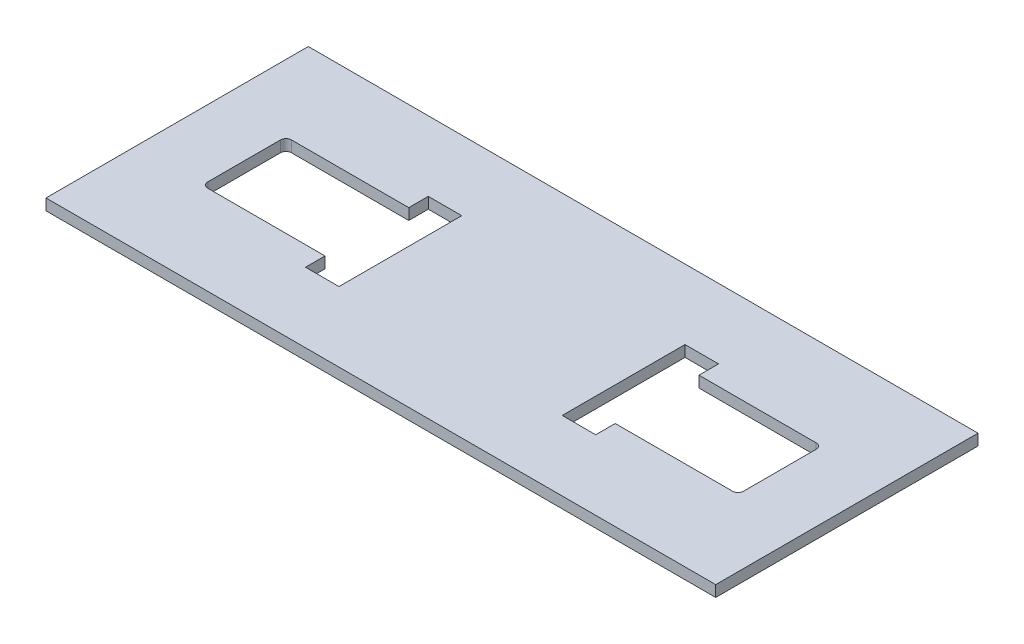
ISO-10303-21;
HEADER;
FILE_DESCRIPTION(('STEP AP214'),'2;1');
FILE_NAME('part.step','',(''),(''),'','','');
FILE_SCHEMA(('AUTOMOTIVE_DESIGN { 1 0 10303 214 1 1 1 1 }'));
ENDSEC;
DATA;
#1=APPLICATION_CONTEXT('core data for automotive mechanical design processes');
#2=APPLICATION_PROTOCOL_DEFINITION('international standard','automotive_design',2000,#1);
#3=PRODUCT_CONTEXT('',#1,'mechanical');
#4=PRODUCT('Part','Part','',(#3));
#5=PRODUCT_RELATED_PRODUCT_CATEGORY('part','',(#4));
#6=PRODUCT_DEFINITION_FORMATION('','',#4);
#7=PRODUCT_DEFINITION_CONTEXT('part definition',#1,'design');
#8=PRODUCT_DEFINITION('design','',#6,#7);
#9=PRODUCT_DEFINITION_SHAPE('','',#8);
#10=(LENGTH_UNIT() NAMED_UNIT(*) SI_UNIT(.MILLI.,.METRE.));
#11=(NAMED_UNIT(*) PLANE_ANGLE_UNIT() SI_UNIT($,.RADIAN.));
#12=(NAMED_UNIT(*) SI_UNIT($,.STERADIAN.) SOLID_ANGLE_UNIT());
#13=UNCERTAINTY_MEASURE_WITH_UNIT(LENGTH_MEASURE(1.E-05),#10,'distance_accuracy_value','');
#14=(GEOMETRIC_REPRESENTATION_CONTEXT(3) GLOBAL_UNCERTAINTY_ASSIGNED_CONTEXT((#13)) GLOBAL_UNIT_ASSIGNED_CONTEXT((#10,
#11,#12)) REPRESENTATION_CONTEXT('',''));
#15=CARTESIAN_POINT('',(0.,0.,0.));
#16=DIRECTION('',(0.,0.,1.));
#17=DIRECTION('',(1.,0.,0.));
#18=AXIS2_PLACEMENT_3D('',#15,#16,#17);
#19=CARTESIAN_POINT('',(0.,6.35,0.));
#20=DIRECTION('',(0.,-1.,0.));
#21=DIRECTION('',(0.,0.,-1.));
#22=AXIS2_PLACEMENT_3D('',#19,#20,#21);
#23=PLANE('',#22);
#24=DIRECTION('',(1.,0.,0.));
#25=VECTOR('',#24,1.);
#26=CARTESIAN_POINT('',(107.95,6.35,-39.6875));
#27=LINE('',#26,#25);
#28=CARTESIAN_POINT('',(107.95,6.35,-39.6875));
#29=VERTEX_POINT('',#28);
#30=CARTESIAN_POINT('',(127.,6.35,-39.6875));
#31=VERTEX_POINT('',#30);
#32=EDGE_CURVE('E198',#29,#31,#27,.T.);
#33=ORIENTED_EDGE('',*,*,#32,.F.);
#34=DIRECTION('',(0.,0.,1.));
#35=VECTOR('',#34,1.);
#36=CARTESIAN_POINT('',(107.95,6.35000000000001,-53.975));
#37=LINE('',#36,#35);
#38=CARTESIAN_POINT('',(107.95,6.35000000000001,-50.8));
#39=VERTEX_POINT('',#38);
#40=EDGE_CURVE('E206',#39,#29,#37,.T.);
#41=ORIENTED_EDGE('',*,*,#40,.F.);
#42=DIRECTION('',(1.,0.,0.));
#43=VECTOR('',#42,1.);
#44=CARTESIAN_POINT('',(123.825,6.35,-50.8));
#45=LINE('',#44,#43);
#46=CARTESIAN_POINT('',(41.275,6.35,-50.8));
#47=VERTEX_POINT('',#46);
#48=EDGE_CURVE('E302',#47,#39,#45,.T.);
#49=ORIENTED_EDGE('',*,*,#48,.F.);
#50=CARTESIAN_POINT('',(41.275,6.35,-53.975));
#51=DIRECTION('',(0.,1.,0.));
#52=DIRECTION('',(0.,0.,1.));
#53=AXIS2_PLACEMENT_3D('',#50,#51,#52);
#54=CIRCLE('',#53,3.17499999999999);
#55=CARTESIAN_POINT('',(38.1,6.35,-53.975));
#56=VERTEX_POINT('',#55);
#57=EDGE_CURVE('E300',#56,#47,#54,.T.);
#58=ORIENTED_EDGE('',*,*,#57,.F.);
#59=DIRECTION('',(0.,0.,1.));
#60=VECTOR('',#59,1.);
#61=CARTESIAN_POINT('',(38.1,6.35,-95.25));
#62=LINE('',#61,#60);
#63=CARTESIAN_POINT('',(38.1,6.35,-95.25));
#64=VERTEX_POINT('',#63);
#65=EDGE_CURVE('E311',#64,#56,#62,.T.);
#66=ORIENTED_EDGE('',*,*,#65,.F.);
#67=CARTESIAN_POINT('',(41.275,6.35,-95.25));
#68=DIRECTION('',(0.,1.,0.));
#69=DIRECTION('',(0.,0.,-1.));
#70=AXIS2_PLACEMENT_3D('',#67,#68,#69);
#71=CIRCLE('',#70,3.175);
#72=CARTESIAN_POINT('',(41.275,6.35,-98.425));
#73=VERTEX_POINT('',#72);
#74=EDGE_CURVE('E308',#73,#64,#71,.T.);
#75=ORIENTED_EDGE('',*,*,#74,.F.);
#76=DIRECTION('',(-1.,0.,0.));
#77=VECTOR('',#76,1.);
#78=CARTESIAN_POINT('',(41.275,6.35,-98.425));
#79=LINE('',#78,#77);
#80=CARTESIAN_POINT('',(107.95,6.35,-98.425));
#81=VERTEX_POINT('',#80);
#82=EDGE_CURVE('E306',#81,#73,#79,.T.);
#83=ORIENTED_EDGE('',*,*,#82,.F.);
#84=DIRECTION('',(0.,0.,1.));
#85=VECTOR('',#84,1.);
#86=CARTESIAN_POINT('',(107.95,6.35000000000001,-95.25));
#87=LINE('',#86,#85);
#88=CARTESIAN_POINT('',(107.95,6.35000000000001,-109.5375));
#89=VERTEX_POINT('',#88);
#90=EDGE_CURVE('E48',#89,#81,#87,.T.);
#91=ORIENTED_EDGE('',*,*,#90,.F.);
#92=DIRECTION('',(-1.,0.,0.));
#93=VECTOR('',#92,1.);
#94=CARTESIAN_POINT('',(107.95,6.35000000000001,-109.5375));
#95=LINE('',#94,#93);
#96=CARTESIAN_POINT('',(127.,6.35000000000001,-109.5375));
#97=VERTEX_POINT('',#96);
#98=EDGE_CURVE('E242',#97,#89,#95,.T.);
#99=ORIENTED_EDGE('',*,*,#98,.F.);
#100=DIRECTION('',(0.,0.,-1.));
#101=VECTOR('',#100,1.);
#102=CARTESIAN_POINT('',(127.,6.35,-95.25));
#103=LINE('',#102,#101);
#104=EDGE_CURVE('E217',#31,#97,#103,.T.);
#105=ORIENTED_EDGE('',*,*,#104,.F.);
#106=EDGE_LOOP('',(#33,#41,#49,#58,#66,#75,#83,#91,#99,#105));
#107=FACE_BOUND('',#106,.T.);
#108=DIRECTION('',(0.,0.,1.));
#109=VECTOR('',#108,1.);
#110=CARTESIAN_POINT('',(0.,6.35,0.));
#111=LINE('',#110,#109);
#112=CARTESIAN_POINT('',(0.,6.35,-149.225));
#113=VERTEX_POINT('',#112);
#114=CARTESIAN_POINT('',(0.,6.35,0.));
#115=VERTEX_POINT('',#114);
#116=EDGE_CURVE('E339',#113,#115,#111,.T.);
#117=ORIENTED_EDGE('',*,*,#116,.T.);
#118=DIRECTION('',(1.,0.,0.));
#119=VECTOR('',#118,1.);
#120=CARTESIAN_POINT('',(0.,6.35,0.));
#121=LINE('',#120,#119);
#122=CARTESIAN_POINT('',(381.,6.35,0.));
#123=VERTEX_POINT('',#122);
#124=EDGE_CURVE('E342',#115,#123,#121,.T.);
#125=ORIENTED_EDGE('',*,*,#124,.T.);
#126=DIRECTION('',(0.,0.,-1.));
#127=VECTOR('',#126,1.);
#128=CARTESIAN_POINT('',(381.,6.35,0.));
#129=LINE('',#128,#127);
#130=CARTESIAN_POINT('',(381.,6.35,-149.225));
#131=VERTEX_POINT('',#130);
#132=EDGE_CURVE('E345',#123,#131,#129,.T.);
#133=ORIENTED_EDGE('',*,*,#132,.T.);
#134=DIRECTION('',(-1.,0.,0.));
#135=VECTOR('',#134,1.);
#136=CARTESIAN_POINT('',(0.,6.35,-149.225));
#137=LINE('',#136,#135);
#138=EDGE_CURVE('E347',#131,#113,#137,.T.);
#139=ORIENTED_EDGE('',*,*,#138,.T.);
#140=EDGE_LOOP('',(#117,#125,#133,#139));
#141=FACE_BOUND('',#140,.T.);
#142=DIRECTION('',(-1.,0.,0.));
#143=VECTOR('',#142,1.);
#144=CARTESIAN_POINT('',(273.05,6.35000000000001,-109.5375));
#145=LINE('',#144,#143);
#146=CARTESIAN_POINT('',(273.05,6.35000000000001,-109.5375));
#147=VERTEX_POINT('',#146);
#148=CARTESIAN_POINT('',(254.,6.35000000000001,-109.5375));
#149=VERTEX_POINT('',#148);
#150=EDGE_CURVE('E234',#147,#149,#145,.T.);
#151=ORIENTED_EDGE('',*,*,#150,.F.);
#152=DIRECTION('',(0.,0.,-1.));
#153=VECTOR('',#152,1.);
#154=CARTESIAN_POINT('',(273.05,6.35000000000001,-95.25));
#155=LINE('',#154,#153);
#156=CARTESIAN_POINT('',(273.05,6.35000000000001,-98.425));
#157=VERTEX_POINT('',#156);
#158=EDGE_CURVE('E231',#157,#147,#155,.T.);
#159=ORIENTED_EDGE('',*,*,#158,.F.);
#160=DIRECTION('',(-1.,0.,0.));
#161=VECTOR('',#160,1.);
#162=CARTESIAN_POINT('',(339.725,6.35,-98.425));
#163=LINE('',#162,#161);
#164=CARTESIAN_POINT('',(339.725,6.35,-98.425));
#165=VERTEX_POINT('',#164);
#166=EDGE_CURVE('E261',#165,#157,#163,.T.);
#167=ORIENTED_EDGE('',*,*,#166,.F.);
#168=CARTESIAN_POINT('',(339.725,6.35,-95.25));
#169=DIRECTION('',(0.,1.,0.));
#170=DIRECTION('',(0.,0.,1.));
#171=AXIS2_PLACEMENT_3D('',#168,#169,#170);
#172=CIRCLE('',#171,3.17500000000002);
#173=CARTESIAN_POINT('',(342.9,6.35,-95.25));
#174=VERTEX_POINT('',#173);
#175=EDGE_CURVE('E259',#174,#165,#172,.T.);
#176=ORIENTED_EDGE('',*,*,#175,.F.);
#177=DIRECTION('',(0.,0.,-1.));
#178=VECTOR('',#177,1.);
#179=CARTESIAN_POINT('',(342.9,6.35,-95.25));
#180=LINE('',#179,#178);
#181=CARTESIAN_POINT('',(342.9,6.35,-53.975));
#182=VERTEX_POINT('',#181);
#183=EDGE_CURVE('E272',#182,#174,#180,.T.);
#184=ORIENTED_EDGE('',*,*,#183,.F.);
#185=CARTESIAN_POINT('',(339.725,6.35,-53.975));
#186=DIRECTION('',(0.,1.,0.));
#187=DIRECTION('',(0.,0.,-1.));
#188=AXIS2_PLACEMENT_3D('',#185,#186,#187);
#189=CIRCLE('',#188,3.17500000000002);
#190=CARTESIAN_POINT('',(339.725,6.35,-50.8));
#191=VERTEX_POINT('',#190);
#192=EDGE_CURVE('E269',#191,#182,#189,.T.);
#193=ORIENTED_EDGE('',*,*,#192,.F.);
#194=DIRECTION('',(1.,0.,0.));
#195=VECTOR('',#194,1.);
#196=CARTESIAN_POINT('',(257.175,6.35,-50.8));
#197=LINE('',#196,#195);
#198=CARTESIAN_POINT('',(273.05,6.35,-50.8));
#199=VERTEX_POINT('',#198);
#200=EDGE_CURVE('E267',#199,#191,#197,.T.);
#201=ORIENTED_EDGE('',*,*,#200,.F.);
#202=DIRECTION('',(0.,0.,-1.));
#203=VECTOR('',#202,1.);
#204=CARTESIAN_POINT('',(273.05,6.35000000000001,-53.975));
#205=LINE('',#204,#203);
#206=CARTESIAN_POINT('',(273.05,6.35,-39.6875));
#207=VERTEX_POINT('',#206);
#208=EDGE_CURVE('E56',#207,#199,#205,.T.);
#209=ORIENTED_EDGE('',*,*,#208,.F.);
#210=DIRECTION('',(1.,0.,0.));
#211=VECTOR('',#210,1.);
#212=CARTESIAN_POINT('',(273.05,6.35,-39.6875));
#213=LINE('',#212,#211);
#214=CARTESIAN_POINT('',(254.,6.35,-39.6875));
#215=VERTEX_POINT('',#214);
#216=EDGE_CURVE('E222',#215,#207,#213,.T.);
#217=ORIENTED_EDGE('',*,*,#216,.F.);
#218=DIRECTION('',(0.,0.,1.));
#219=VECTOR('',#218,1.);
#220=CARTESIAN_POINT('',(254.,6.35,-95.25));
#221=LINE('',#220,#219);
#222=EDGE_CURVE('E265',#149,#215,#221,.T.);
#223=ORIENTED_EDGE('',*,*,#222,.F.);
#224=EDGE_LOOP('',(#151,#159,#167,#176,#184,#193,#201,#209,#217,#223));
#225=FACE_BOUND('',#224,.T.);
#226=ADVANCED_FACE('F33',(#107,#141,#225),#23,.F.);
#227=CARTESIAN_POINT('',(0.,0.,0.));
#228=DIRECTION('',(0.,-1.,0.));
#229=DIRECTION('',(0.,0.,-1.));
#230=AXIS2_PLACEMENT_3D('',#227,#228,#229);
#231=PLANE('',#230);
#232=DIRECTION('',(0.,0.,1.));
#233=VECTOR('',#232,1.);
#234=CARTESIAN_POINT('',(273.05,0.,0.));
#235=LINE('',#234,#233);
#236=CARTESIAN_POINT('',(273.05,0.,-109.5375));
#237=VERTEX_POINT('',#236);
#238=CARTESIAN_POINT('',(273.05,0.,-98.425));
#239=VERTEX_POINT('',#238);
#240=EDGE_CURVE('E252',#237,#239,#235,.T.);
#241=ORIENTED_EDGE('',*,*,#240,.F.);
#242=DIRECTION('',(1.,0.,0.));
#243=VECTOR('',#242,1.);
#244=CARTESIAN_POINT('',(0.,0.,-109.5375));
#245=LINE('',#244,#243);
#246=CARTESIAN_POINT('',(254.,0.,-109.5375));
#247=VERTEX_POINT('',#246);
#248=EDGE_CURVE('E11',#247,#237,#245,.T.);
#249=ORIENTED_EDGE('',*,*,#248,.F.);
#250=DIRECTION('',(0.,0.,1.));
#251=VECTOR('',#250,1.);
#252=CARTESIAN_POINT('',(254.,0.,-95.25));
#253=LINE('',#252,#251);
#254=CARTESIAN_POINT('',(254.,0.,-39.6875));
#255=VERTEX_POINT('',#254);
#256=EDGE_CURVE('E280',#247,#255,#253,.T.);
#257=ORIENTED_EDGE('',*,*,#256,.T.);
#258=DIRECTION('',(-1.,0.,0.));
#259=VECTOR('',#258,1.);
#260=CARTESIAN_POINT('',(0.,0.,-39.6875));
#261=LINE('',#260,#259);
#262=CARTESIAN_POINT('',(273.05,0.,-39.6875));
#263=VERTEX_POINT('',#262);
#264=EDGE_CURVE('E41',#263,#255,#261,.T.);
#265=ORIENTED_EDGE('',*,*,#264,.F.);
#266=DIRECTION('',(0.,0.,1.));
#267=VECTOR('',#266,1.);
#268=CARTESIAN_POINT('',(273.05,0.,0.));
#269=LINE('',#268,#267);
#270=CARTESIAN_POINT('',(273.05,0.,-50.8));
#271=VERTEX_POINT('',#270);
#272=EDGE_CURVE('E248',#271,#263,#269,.T.);
#273=ORIENTED_EDGE('',*,*,#272,.F.);
#274=DIRECTION('',(1.,0.,0.));
#275=VECTOR('',#274,1.);
#276=CARTESIAN_POINT('',(257.175,0.,-50.8));
#277=LINE('',#276,#275);
#278=CARTESIAN_POINT('',(339.725,0.,-50.8));
#279=VERTEX_POINT('',#278);
#280=EDGE_CURVE('E282',#271,#279,#277,.T.);
#281=ORIENTED_EDGE('',*,*,#280,.T.);
#282=CARTESIAN_POINT('',(339.725,0.,-53.975));
#283=DIRECTION('',(0.,1.,0.));
#284=DIRECTION('',(0.,0.,-1.));
#285=AXIS2_PLACEMENT_3D('',#282,#283,#284);
#286=CIRCLE('',#285,3.17500000000002);
#287=CARTESIAN_POINT('',(342.9,0.,-53.975));
#288=VERTEX_POINT('',#287);
#289=EDGE_CURVE('E284',#279,#288,#286,.T.);
#290=ORIENTED_EDGE('',*,*,#289,.T.);
#291=DIRECTION('',(0.,0.,-1.));
#292=VECTOR('',#291,1.);
#293=CARTESIAN_POINT('',(342.9,0.,-95.25));
#294=LINE('',#293,#292);
#295=CARTESIAN_POINT('',(342.9,0.,-95.25));
#296=VERTEX_POINT('',#295);
#297=EDGE_CURVE('E262',#288,#296,#294,.T.);
#298=ORIENTED_EDGE('',*,*,#297,.T.);
#299=CARTESIAN_POINT('',(339.725,0.,-95.25));
#300=DIRECTION('',(0.,1.,0.));
#301=DIRECTION('',(0.,0.,1.));
#302=AXIS2_PLACEMENT_3D('',#299,#300,#301);
#303=CIRCLE('',#302,3.17500000000002);
#304=CARTESIAN_POINT('',(339.725,0.,-98.425));
#305=VERTEX_POINT('',#304);
#306=EDGE_CURVE('E258',#296,#305,#303,.T.);
#307=ORIENTED_EDGE('',*,*,#306,.T.);
#308=DIRECTION('',(-1.,0.,0.));
#309=VECTOR('',#308,1.);
#310=CARTESIAN_POINT('',(339.725,0.,-98.425));
#311=LINE('',#310,#309);
#312=EDGE_CURVE('E277',#305,#239,#311,.T.);
#313=ORIENTED_EDGE('',*,*,#312,.T.);
#314=EDGE_LOOP('',(#241,#249,#257,#265,#273,#281,#290,#298,#307,#313));
#315=FACE_BOUND('',#314,.T.);
#316=DIRECTION('',(0.,0.,-1.));
#317=VECTOR('',#316,1.);
#318=CARTESIAN_POINT('',(107.95,0.,0.));
#319=LINE('',#318,#317);
#320=CARTESIAN_POINT('',(107.95,0.,-39.6875));
#321=VERTEX_POINT('',#320);
#322=CARTESIAN_POINT('',(107.95,0.,-50.8));
#323=VERTEX_POINT('',#322);
#324=EDGE_CURVE('E256',#321,#323,#319,.T.);
#325=ORIENTED_EDGE('',*,*,#324,.F.);
#326=DIRECTION('',(-1.,0.,0.));
#327=VECTOR('',#326,1.);
#328=CARTESIAN_POINT('',(0.,0.,-39.6875));
#329=LINE('',#328,#327);
#330=CARTESIAN_POINT('',(127.,0.,-39.6875));
#331=VERTEX_POINT('',#330);
#332=EDGE_CURVE('E200',#331,#321,#329,.T.);
#333=ORIENTED_EDGE('',*,*,#332,.F.);
#334=DIRECTION('',(0.,0.,-1.));
#335=VECTOR('',#334,1.);
#336=CARTESIAN_POINT('',(127.,0.,-95.25));
#337=LINE('',#336,#335);
#338=CARTESIAN_POINT('',(127.,0.,-109.5375));
#339=VERTEX_POINT('',#338);
#340=EDGE_CURVE('E319',#331,#339,#337,.T.);
#341=ORIENTED_EDGE('',*,*,#340,.T.);
#342=DIRECTION('',(1.,0.,0.));
#343=VECTOR('',#342,1.);
#344=CARTESIAN_POINT('',(0.,0.,-109.5375));
#345=LINE('',#344,#343);
#346=CARTESIAN_POINT('',(107.95,0.,-109.5375));
#347=VERTEX_POINT('',#346);
#348=EDGE_CURVE('E375',#347,#339,#345,.T.);
#349=ORIENTED_EDGE('',*,*,#348,.F.);
#350=DIRECTION('',(0.,0.,-1.));
#351=VECTOR('',#350,1.);
#352=CARTESIAN_POINT('',(107.95,0.,0.));
#353=LINE('',#352,#351);
#354=CARTESIAN_POINT('',(107.95,0.,-98.425));
#355=VERTEX_POINT('',#354);
#356=EDGE_CURVE('E254',#355,#347,#353,.T.);
#357=ORIENTED_EDGE('',*,*,#356,.F.);
#358=DIRECTION('',(-1.,0.,0.));
#359=VECTOR('',#358,1.);
#360=CARTESIAN_POINT('',(41.275,0.,-98.425));
#361=LINE('',#360,#359);
#362=CARTESIAN_POINT('',(41.275,0.,-98.425));
#363=VERTEX_POINT('',#362);
#364=EDGE_CURVE('E321',#355,#363,#361,.T.);
#365=ORIENTED_EDGE('',*,*,#364,.T.);
#366=CARTESIAN_POINT('',(41.275,0.,-95.25));
#367=DIRECTION('',(0.,1.,0.));
#368=DIRECTION('',(0.,0.,-1.));
#369=AXIS2_PLACEMENT_3D('',#366,#367,#368);
#370=CIRCLE('',#369,3.175);
#371=CARTESIAN_POINT('',(38.1,0.,-95.25));
#372=VERTEX_POINT('',#371);
#373=EDGE_CURVE('E323',#363,#372,#370,.T.);
#374=ORIENTED_EDGE('',*,*,#373,.T.);
#375=DIRECTION('',(0.,0.,1.));
#376=VECTOR('',#375,1.);
#377=CARTESIAN_POINT('',(38.1,0.,-95.25));
#378=LINE('',#377,#376);
#379=CARTESIAN_POINT('',(38.1,0.,-53.975));
#380=VERTEX_POINT('',#379);
#381=EDGE_CURVE('E303',#372,#380,#378,.T.);
#382=ORIENTED_EDGE('',*,*,#381,.T.);
#383=CARTESIAN_POINT('',(41.275,0.,-53.975));
#384=DIRECTION('',(0.,1.,0.));
#385=DIRECTION('',(0.,0.,1.));
#386=AXIS2_PLACEMENT_3D('',#383,#384,#385);
#387=CIRCLE('',#386,3.17499999999999);
#388=CARTESIAN_POINT('',(41.275,0.,-50.8));
#389=VERTEX_POINT('',#388);
#390=EDGE_CURVE('E299',#380,#389,#387,.T.);
#391=ORIENTED_EDGE('',*,*,#390,.T.);
#392=DIRECTION('',(1.,0.,0.));
#393=VECTOR('',#392,1.);
#394=CARTESIAN_POINT('',(123.825,0.,-50.8));
#395=LINE('',#394,#393);
#396=EDGE_CURVE('E316',#389,#323,#395,.T.);
#397=ORIENTED_EDGE('',*,*,#396,.T.);
#398=EDGE_LOOP('',(#325,#333,#341,#349,#357,#365,#374,#382,#391,#397));
#399=FACE_BOUND('',#398,.T.);
#400=DIRECTION('',(0.,0.,1.));
#401=VECTOR('',#400,1.);
#402=CARTESIAN_POINT('',(0.,0.,0.));
#403=LINE('',#402,#401);
#404=CARTESIAN_POINT('',(0.,0.,-149.225));
#405=VERTEX_POINT('',#404);
#406=CARTESIAN_POINT('',(0.,0.,0.));
#407=VERTEX_POINT('',#406);
#408=EDGE_CURVE('E338',#405,#407,#403,.T.);
#409=ORIENTED_EDGE('',*,*,#408,.F.);
#410=DIRECTION('',(-1.,0.,0.));
#411=VECTOR('',#410,1.);
#412=CARTESIAN_POINT('',(0.,0.,-149.225));
#413=LINE('',#412,#411);
#414=CARTESIAN_POINT('',(381.,0.,-149.225));
#415=VERTEX_POINT('',#414);
#416=EDGE_CURVE('E343',#415,#405,#413,.T.);
#417=ORIENTED_EDGE('',*,*,#416,.F.);
#418=DIRECTION('',(0.,0.,-1.));
#419=VECTOR('',#418,1.);
#420=CARTESIAN_POINT('',(381.,0.,0.));
#421=LINE('',#420,#419);
#422=CARTESIAN_POINT('',(381.,0.,0.));
#423=VERTEX_POINT('',#422);
#424=EDGE_CURVE('E354',#423,#415,#421,.T.);
#425=ORIENTED_EDGE('',*,*,#424,.F.);
#426=DIRECTION('',(1.,0.,0.));
#427=VECTOR('',#426,1.);
#428=CARTESIAN_POINT('',(0.,0.,0.));
#429=LINE('',#428,#427);
#430=EDGE_CURVE('E352',#407,#423,#429,.T.);
#431=ORIENTED_EDGE('',*,*,#430,.F.);
#432=EDGE_LOOP('',(#409,#417,#425,#431));
#433=FACE_BOUND('',#432,.T.);
#434=ADVANCED_FACE('F405',(#315,#399,#433),#231,.T.);
#435=CARTESIAN_POINT('',(0.,6.35,0.));
#436=DIRECTION('',(1.,0.,0.));
#437=DIRECTION('',(0.,0.,-1.));
#438=AXIS2_PLACEMENT_3D('',#435,#436,#437);
#439=PLANE('',#438);
#440=ORIENTED_EDGE('',*,*,#408,.T.);
#441=DIRECTION('',(0.,-1.,0.));
#442=VECTOR('',#441,1.);
#443=CARTESIAN_POINT('',(0.,6.35,0.));
#444=LINE('',#443,#442);
#445=EDGE_CURVE('E365',#115,#407,#444,.T.);
#446=ORIENTED_EDGE('',*,*,#445,.F.);
#447=ORIENTED_EDGE('',*,*,#116,.F.);
#448=DIRECTION('',(0.,-1.,0.));
#449=VECTOR('',#448,1.);
#450=CARTESIAN_POINT('',(0.,6.35,-149.225));
#451=LINE('',#450,#449);
#452=EDGE_CURVE('E349',#113,#405,#451,.T.);
#453=ORIENTED_EDGE('',*,*,#452,.T.);
#454=EDGE_LOOP('',(#440,#446,#447,#453));
#455=FACE_BOUND('',#454,.T.);
#456=ADVANCED_FACE('F35',(#455),#439,.F.);
#457=CARTESIAN_POINT('',(0.,6.35,0.));
#458=DIRECTION('',(0.,0.,-1.));
#459=DIRECTION('',(-1.,0.,0.));
#460=AXIS2_PLACEMENT_3D('',#457,#458,#459);
#461=PLANE('',#460);
#462=ORIENTED_EDGE('',*,*,#430,.T.);
#463=DIRECTION('',(0.,-1.,0.));
#464=VECTOR('',#463,1.);
#465=CARTESIAN_POINT('',(381.,6.35,0.));
#466=LINE('',#465,#464);
#467=EDGE_CURVE('E362',#123,#423,#466,.T.);
#468=ORIENTED_EDGE('',*,*,#467,.F.);
#469=ORIENTED_EDGE('',*,*,#124,.F.);
#470=ORIENTED_EDGE('',*,*,#445,.T.);
#471=EDGE_LOOP('',(#462,#468,#469,#470));
#472=FACE_BOUND('',#471,.T.);
#473=ADVANCED_FACE('F436',(#472),#461,.F.);
#474=CARTESIAN_POINT('',(381.,6.35,0.));
#475=DIRECTION('',(-1.,0.,0.));
#476=DIRECTION('',(0.,0.,1.));
#477=AXIS2_PLACEMENT_3D('',#474,#475,#476);
#478=PLANE('',#477);
#479=ORIENTED_EDGE('',*,*,#424,.T.);
#480=DIRECTION('',(0.,-1.,0.));
#481=VECTOR('',#480,1.);
#482=CARTESIAN_POINT('',(381.,6.35,-149.225));
#483=LINE('',#482,#481);
#484=EDGE_CURVE('E359',#131,#415,#483,.T.);
#485=ORIENTED_EDGE('',*,*,#484,.F.);
#486=ORIENTED_EDGE('',*,*,#132,.F.);
#487=ORIENTED_EDGE('',*,*,#467,.T.);
#488=EDGE_LOOP('',(#479,#485,#486,#487));
#489=FACE_BOUND('',#488,.T.);
#490=ADVANCED_FACE('F433',(#489),#478,.F.);
#491=CARTESIAN_POINT('',(0.,6.35,-149.225));
#492=DIRECTION('',(0.,0.,1.));
#493=DIRECTION('',(1.,0.,0.));
#494=AXIS2_PLACEMENT_3D('',#491,#492,#493);
#495=PLANE('',#494);
#496=ORIENTED_EDGE('',*,*,#416,.T.);
#497=ORIENTED_EDGE('',*,*,#452,.F.);
#498=ORIENTED_EDGE('',*,*,#138,.F.);
#499=ORIENTED_EDGE('',*,*,#484,.T.);
#500=EDGE_LOOP('',(#496,#497,#498,#499));
#501=FACE_BOUND('',#500,.T.);
#502=ADVANCED_FACE('F430',(#501),#495,.F.);
#503=CARTESIAN_POINT('',(41.275,6.35,-53.975));
#504=DIRECTION('',(0.,-1.,0.));
#505=DIRECTION('',(0.,0.,-1.));
#506=AXIS2_PLACEMENT_3D('',#503,#504,#505);
#507=CYLINDRICAL_SURFACE('',#506,3.17499999999999);
#508=ORIENTED_EDGE('',*,*,#390,.F.);
#509=DIRECTION('',(0.,-1.,0.));
#510=VECTOR('',#509,1.);
#511=CARTESIAN_POINT('',(38.1,6.35,-53.975));
#512=LINE('',#511,#510);
#513=EDGE_CURVE('E313',#56,#380,#512,.T.);
#514=ORIENTED_EDGE('',*,*,#513,.F.);
#515=ORIENTED_EDGE('',*,*,#57,.T.);
#516=DIRECTION('',(0.,-1.,0.));
#517=VECTOR('',#516,1.);
#518=CARTESIAN_POINT('',(41.275,6.35,-50.8));
#519=LINE('',#518,#517);
#520=EDGE_CURVE('E335',#47,#389,#519,.T.);
#521=ORIENTED_EDGE('',*,*,#520,.T.);
#522=EDGE_LOOP('',(#508,#514,#515,#521));
#523=FACE_BOUND('',#522,.T.);
#524=ADVANCED_FACE('F427',(#523),#507,.F.);
#525=CARTESIAN_POINT('',(123.825,6.35,-50.8));
#526=DIRECTION('',(0.,0.,-1.));
#527=DIRECTION('',(-1.,0.,0.));
#528=AXIS2_PLACEMENT_3D('',#525,#526,#527);
#529=PLANE('',#528);
#530=DIRECTION('',(0.,1.,0.));
#531=VECTOR('',#530,1.);
#532=CARTESIAN_POINT('',(107.95,6.35,-50.8));
#533=LINE('',#532,#531);
#534=EDGE_CURVE('E209',#323,#39,#533,.T.);
#535=ORIENTED_EDGE('',*,*,#534,.F.);
#536=ORIENTED_EDGE('',*,*,#396,.F.);
#537=ORIENTED_EDGE('',*,*,#520,.F.);
#538=ORIENTED_EDGE('',*,*,#48,.T.);
#539=EDGE_LOOP('',(#535,#536,#537,#538));
#540=FACE_BOUND('',#539,.T.);
#541=ADVANCED_FACE('F469',(#540),#529,.T.);
#542=CARTESIAN_POINT('',(127.,6.35,-95.25));
#543=DIRECTION('',(-1.,0.,0.));
#544=DIRECTION('',(0.,0.,1.));
#545=AXIS2_PLACEMENT_3D('',#542,#543,#544);
#546=PLANE('',#545);
#547=ORIENTED_EDGE('',*,*,#340,.F.);
#548=DIRECTION('',(0.,1.,0.));
#549=VECTOR('',#548,1.);
#550=CARTESIAN_POINT('',(127.,-1.27,-39.6875));
#551=LINE('',#550,#549);
#552=EDGE_CURVE('E203',#331,#31,#551,.T.);
#553=ORIENTED_EDGE('',*,*,#552,.T.);
#554=ORIENTED_EDGE('',*,*,#104,.T.);
#555=DIRECTION('',(0.,1.,0.));
#556=VECTOR('',#555,1.);
#557=CARTESIAN_POINT('',(127.,-1.26999999999999,-109.5375));
#558=LINE('',#557,#556);
#559=EDGE_CURVE('E245',#339,#97,#558,.T.);
#560=ORIENTED_EDGE('',*,*,#559,.F.);
#561=EDGE_LOOP('',(#547,#553,#554,#560));
#562=FACE_BOUND('',#561,.T.);
#563=ADVANCED_FACE('F474',(#562),#546,.T.);
#564=CARTESIAN_POINT('',(41.275,6.35,-98.425));
#565=DIRECTION('',(0.,0.,1.));
#566=DIRECTION('',(1.,0.,0.));
#567=AXIS2_PLACEMENT_3D('',#564,#565,#566);
#568=PLANE('',#567);
#569=DIRECTION('',(0.,-1.,0.));
#570=VECTOR('',#569,1.);
#571=CARTESIAN_POINT('',(107.95,6.35,-98.425));
#572=LINE('',#571,#570);
#573=EDGE_CURVE('E372',#81,#355,#572,.T.);
#574=ORIENTED_EDGE('',*,*,#573,.F.);
#575=ORIENTED_EDGE('',*,*,#82,.T.);
#576=DIRECTION('',(0.,-1.,0.));
#577=VECTOR('',#576,1.);
#578=CARTESIAN_POINT('',(41.275,6.35,-98.425));
#579=LINE('',#578,#577);
#580=EDGE_CURVE('E332',#73,#363,#579,.T.);
#581=ORIENTED_EDGE('',*,*,#580,.T.);
#582=ORIENTED_EDGE('',*,*,#364,.F.);
#583=EDGE_LOOP('',(#574,#575,#581,#582));
#584=FACE_BOUND('',#583,.T.);
#585=ADVANCED_FACE('F486',(#584),#568,.T.);
#586=CARTESIAN_POINT('',(41.275,6.35,-95.25));
#587=DIRECTION('',(0.,-1.,0.));
#588=DIRECTION('',(0.,0.,-1.));
#589=AXIS2_PLACEMENT_3D('',#586,#587,#588);
#590=CYLINDRICAL_SURFACE('',#589,3.175);
#591=ORIENTED_EDGE('',*,*,#373,.F.);
#592=ORIENTED_EDGE('',*,*,#580,.F.);
#593=ORIENTED_EDGE('',*,*,#74,.T.);
#594=DIRECTION('',(0.,-1.,0.));
#595=VECTOR('',#594,1.);
#596=CARTESIAN_POINT('',(38.1,6.35,-95.25));
#597=LINE('',#596,#595);
#598=EDGE_CURVE('E330',#64,#372,#597,.T.);
#599=ORIENTED_EDGE('',*,*,#598,.T.);
#600=EDGE_LOOP('',(#591,#592,#593,#599));
#601=FACE_BOUND('',#600,.T.);
#602=ADVANCED_FACE('F498',(#601),#590,.F.);
#603=CARTESIAN_POINT('',(38.1,6.35,-95.25));
#604=DIRECTION('',(1.,0.,0.));
#605=DIRECTION('',(0.,0.,-1.));
#606=AXIS2_PLACEMENT_3D('',#603,#604,#605);
#607=PLANE('',#606);
#608=ORIENTED_EDGE('',*,*,#381,.F.);
#609=ORIENTED_EDGE('',*,*,#598,.F.);
#610=ORIENTED_EDGE('',*,*,#65,.T.);
#611=ORIENTED_EDGE('',*,*,#513,.T.);
#612=EDGE_LOOP('',(#608,#609,#610,#611));
#613=FACE_BOUND('',#612,.T.);
#614=ADVANCED_FACE('F603',(#613),#607,.T.);
#615=CARTESIAN_POINT('',(339.725,6.35,-95.25));
#616=DIRECTION('',(0.,-1.,0.));
#617=DIRECTION('',(0.,0.,-1.));
#618=AXIS2_PLACEMENT_3D('',#615,#616,#617);
#619=CYLINDRICAL_SURFACE('',#618,3.17500000000002);
#620=ORIENTED_EDGE('',*,*,#306,.F.);
#621=DIRECTION('',(0.,-1.,0.));
#622=VECTOR('',#621,1.);
#623=CARTESIAN_POINT('',(342.9,6.35,-95.25));
#624=LINE('',#623,#622);
#625=EDGE_CURVE('E274',#174,#296,#624,.T.);
#626=ORIENTED_EDGE('',*,*,#625,.F.);
#627=ORIENTED_EDGE('',*,*,#175,.T.);
#628=DIRECTION('',(0.,-1.,0.));
#629=VECTOR('',#628,1.);
#630=CARTESIAN_POINT('',(339.725,6.35,-98.425));
#631=LINE('',#630,#629);
#632=EDGE_CURVE('E296',#165,#305,#631,.T.);
#633=ORIENTED_EDGE('',*,*,#632,.T.);
#634=EDGE_LOOP('',(#620,#626,#627,#633));
#635=FACE_BOUND('',#634,.T.);
#636=ADVANCED_FACE('F511',(#635),#619,.F.);
#637=CARTESIAN_POINT('',(339.725,6.35,-98.425));
#638=DIRECTION('',(0.,0.,1.));
#639=DIRECTION('',(1.,0.,0.));
#640=AXIS2_PLACEMENT_3D('',#637,#638,#639);
#641=PLANE('',#640);
#642=DIRECTION('',(0.,1.,0.));
#643=VECTOR('',#642,1.);
#644=CARTESIAN_POINT('',(273.05,6.35,-98.425));
#645=LINE('',#644,#643);
#646=EDGE_CURVE('E370',#239,#157,#645,.T.);
#647=ORIENTED_EDGE('',*,*,#646,.F.);
#648=ORIENTED_EDGE('',*,*,#312,.F.);
#649=ORIENTED_EDGE('',*,*,#632,.F.);
#650=ORIENTED_EDGE('',*,*,#166,.T.);
#651=EDGE_LOOP('',(#647,#648,#649,#650));
#652=FACE_BOUND('',#651,.T.);
#653=ADVANCED_FACE('F506',(#652),#641,.T.);
#654=CARTESIAN_POINT('',(254.,6.35,-95.25));
#655=DIRECTION('',(1.,0.,0.));
#656=DIRECTION('',(0.,0.,-1.));
#657=AXIS2_PLACEMENT_3D('',#654,#655,#656);
#658=PLANE('',#657);
#659=ORIENTED_EDGE('',*,*,#256,.F.);
#660=DIRECTION('',(0.,1.,0.));
#661=VECTOR('',#660,1.);
#662=CARTESIAN_POINT('',(254.,-1.26999999999999,-109.5375));
#663=LINE('',#662,#661);
#664=EDGE_CURVE('E225',#247,#149,#663,.T.);
#665=ORIENTED_EDGE('',*,*,#664,.T.);
#666=ORIENTED_EDGE('',*,*,#222,.T.);
#667=DIRECTION('',(0.,1.,0.));
#668=VECTOR('',#667,1.);
#669=CARTESIAN_POINT('',(254.,-1.27,-39.6875));
#670=LINE('',#669,#668);
#671=EDGE_CURVE('E227',#255,#215,#670,.T.);
#672=ORIENTED_EDGE('',*,*,#671,.F.);
#673=EDGE_LOOP('',(#659,#665,#666,#672));
#674=FACE_BOUND('',#673,.T.);
#675=ADVANCED_FACE('F388',(#674),#658,.T.);
#676=CARTESIAN_POINT('',(257.175,6.35,-50.8));
#677=DIRECTION('',(0.,0.,-1.));
#678=DIRECTION('',(-1.,0.,0.));
#679=AXIS2_PLACEMENT_3D('',#676,#677,#678);
#680=PLANE('',#679);
#681=DIRECTION('',(0.,-1.,0.));
#682=VECTOR('',#681,1.);
#683=CARTESIAN_POINT('',(273.05,6.35,-50.8));
#684=LINE('',#683,#682);
#685=EDGE_CURVE('E368',#199,#271,#684,.T.);
#686=ORIENTED_EDGE('',*,*,#685,.F.);
#687=ORIENTED_EDGE('',*,*,#200,.T.);
#688=DIRECTION('',(0.,-1.,0.));
#689=VECTOR('',#688,1.);
#690=CARTESIAN_POINT('',(339.725,6.35,-50.8));
#691=LINE('',#690,#689);
#692=EDGE_CURVE('E293',#191,#279,#691,.T.);
#693=ORIENTED_EDGE('',*,*,#692,.T.);
#694=ORIENTED_EDGE('',*,*,#280,.F.);
#695=EDGE_LOOP('',(#686,#687,#693,#694));
#696=FACE_BOUND('',#695,.T.);
#697=ADVANCED_FACE('F398',(#696),#680,.T.);
#698=CARTESIAN_POINT('',(339.725,6.35,-53.975));
#699=DIRECTION('',(0.,-1.,0.));
#700=DIRECTION('',(0.,0.,-1.));
#701=AXIS2_PLACEMENT_3D('',#698,#699,#700);
#702=CYLINDRICAL_SURFACE('',#701,3.17500000000002);
#703=ORIENTED_EDGE('',*,*,#289,.F.);
#704=ORIENTED_EDGE('',*,*,#692,.F.);
#705=ORIENTED_EDGE('',*,*,#192,.T.);
#706=DIRECTION('',(0.,-1.,0.));
#707=VECTOR('',#706,1.);
#708=CARTESIAN_POINT('',(342.9,6.35,-53.975));
#709=LINE('',#708,#707);
#710=EDGE_CURVE('E291',#182,#288,#709,.T.);
#711=ORIENTED_EDGE('',*,*,#710,.T.);
#712=EDGE_LOOP('',(#703,#704,#705,#711));
#713=FACE_BOUND('',#712,.T.);
#714=ADVANCED_FACE('F402',(#713),#702,.F.);
#715=CARTESIAN_POINT('',(342.9,6.35,-95.25));
#716=DIRECTION('',(-1.,0.,0.));
#717=DIRECTION('',(0.,0.,1.));
#718=AXIS2_PLACEMENT_3D('',#715,#716,#717);
#719=PLANE('',#718);
#720=ORIENTED_EDGE('',*,*,#297,.F.);
#721=ORIENTED_EDGE('',*,*,#710,.F.);
#722=ORIENTED_EDGE('',*,*,#183,.T.);
#723=ORIENTED_EDGE('',*,*,#625,.T.);
#724=EDGE_LOOP('',(#720,#721,#722,#723));
#725=FACE_BOUND('',#724,.T.);
#726=ADVANCED_FACE('F409',(#725),#719,.T.);
#727=CARTESIAN_POINT('',(273.05,-1.26999999999999,-53.975));
#728=DIRECTION('',(1.,0.,0.));
#729=DIRECTION('',(0.,1.,0.));
#730=AXIS2_PLACEMENT_3D('',#727,#728,#729);
#731=PLANE('',#730);
#732=ORIENTED_EDGE('',*,*,#272,.T.);
#733=DIRECTION('',(0.,1.,0.));
#734=VECTOR('',#733,1.);
#735=CARTESIAN_POINT('',(273.05,-1.27,-39.6875));
#736=LINE('',#735,#734);
#737=EDGE_CURVE('E213',#263,#207,#736,.T.);
#738=ORIENTED_EDGE('',*,*,#737,.T.);
#739=ORIENTED_EDGE('',*,*,#208,.T.);
#740=ORIENTED_EDGE('',*,*,#685,.T.);
#741=EDGE_LOOP('',(#732,#738,#739,#740));
#742=FACE_BOUND('',#741,.T.);
#743=ADVANCED_FACE('F407',(#742),#731,.F.);
#744=CARTESIAN_POINT('',(273.05,-1.27,-39.6875));
#745=DIRECTION('',(0.,0.,1.));
#746=DIRECTION('',(0.,-1.,0.));
#747=AXIS2_PLACEMENT_3D('',#744,#745,#746);
#748=PLANE('',#747);
#749=ORIENTED_EDGE('',*,*,#264,.T.);
#750=ORIENTED_EDGE('',*,*,#671,.T.);
#751=ORIENTED_EDGE('',*,*,#216,.T.);
#752=ORIENTED_EDGE('',*,*,#737,.F.);
#753=EDGE_LOOP('',(#749,#750,#751,#752));
#754=FACE_BOUND('',#753,.T.);
#755=ADVANCED_FACE('F383',(#754),#748,.F.);
#756=CARTESIAN_POINT('',(273.05,-1.26999999999999,-95.25));
#757=DIRECTION('',(1.,0.,0.));
#758=DIRECTION('',(0.,1.,0.));
#759=AXIS2_PLACEMENT_3D('',#756,#757,#758);
#760=PLANE('',#759);
#761=ORIENTED_EDGE('',*,*,#240,.T.);
#762=ORIENTED_EDGE('',*,*,#646,.T.);
#763=ORIENTED_EDGE('',*,*,#158,.T.);
#764=DIRECTION('',(0.,1.,0.));
#765=VECTOR('',#764,1.);
#766=CARTESIAN_POINT('',(273.05,-1.26999999999999,-109.5375));
#767=LINE('',#766,#765);
#768=EDGE_CURVE('E237',#237,#147,#767,.T.);
#769=ORIENTED_EDGE('',*,*,#768,.F.);
#770=EDGE_LOOP('',(#761,#762,#763,#769));
#771=FACE_BOUND('',#770,.T.);
#772=ADVANCED_FACE('F415',(#771),#760,.F.);
#773=CARTESIAN_POINT('',(273.05,-1.26999999999999,-109.5375));
#774=DIRECTION('',(0.,0.,-1.));
#775=DIRECTION('',(0.,1.,0.));
#776=AXIS2_PLACEMENT_3D('',#773,#774,#775);
#777=PLANE('',#776);
#778=ORIENTED_EDGE('',*,*,#248,.T.);
#779=ORIENTED_EDGE('',*,*,#768,.T.);
#780=ORIENTED_EDGE('',*,*,#150,.T.);
#781=ORIENTED_EDGE('',*,*,#664,.F.);
#782=EDGE_LOOP('',(#778,#779,#780,#781));
#783=FACE_BOUND('',#782,.T.);
#784=ADVANCED_FACE('F552',(#783),#777,.F.);
#785=CARTESIAN_POINT('',(107.95,-1.26999999999999,-95.25));
#786=DIRECTION('',(-1.,0.,0.));
#787=DIRECTION('',(0.,-1.,0.));
#788=AXIS2_PLACEMENT_3D('',#785,#786,#787);
#789=PLANE('',#788);
#790=ORIENTED_EDGE('',*,*,#356,.T.);
#791=DIRECTION('',(0.,1.,0.));
#792=VECTOR('',#791,1.);
#793=CARTESIAN_POINT('',(107.95,-1.26999999999999,-109.5375));
#794=LINE('',#793,#792);
#795=EDGE_CURVE('E246',#347,#89,#794,.T.);
#796=ORIENTED_EDGE('',*,*,#795,.T.);
#797=ORIENTED_EDGE('',*,*,#90,.T.);
#798=ORIENTED_EDGE('',*,*,#573,.T.);
#799=EDGE_LOOP('',(#790,#796,#797,#798));
#800=FACE_BOUND('',#799,.T.);
#801=ADVANCED_FACE('F562',(#800),#789,.F.);
#802=CARTESIAN_POINT('',(107.95,-1.26999999999999,-109.5375));
#803=DIRECTION('',(0.,0.,-1.));
#804=DIRECTION('',(0.,1.,0.));
#805=AXIS2_PLACEMENT_3D('',#802,#803,#804);
#806=PLANE('',#805);
#807=ORIENTED_EDGE('',*,*,#348,.T.);
#808=ORIENTED_EDGE('',*,*,#559,.T.);
#809=ORIENTED_EDGE('',*,*,#98,.T.);
#810=ORIENTED_EDGE('',*,*,#795,.F.);
#811=EDGE_LOOP('',(#807,#808,#809,#810));
#812=FACE_BOUND('',#811,.T.);
#813=ADVANCED_FACE('F572',(#812),#806,.F.);
#814=CARTESIAN_POINT('',(107.95,-1.26999999999999,-53.975));
#815=DIRECTION('',(-1.,0.,0.));
#816=DIRECTION('',(0.,-1.,0.));
#817=AXIS2_PLACEMENT_3D('',#814,#815,#816);
#818=PLANE('',#817);
#819=ORIENTED_EDGE('',*,*,#324,.T.);
#820=ORIENTED_EDGE('',*,*,#534,.T.);
#821=ORIENTED_EDGE('',*,*,#40,.T.);
#822=DIRECTION('',(0.,1.,0.));
#823=VECTOR('',#822,1.);
#824=CARTESIAN_POINT('',(107.95,-1.27,-39.6875));
#825=LINE('',#824,#823);
#826=EDGE_CURVE('E193',#321,#29,#825,.T.);
#827=ORIENTED_EDGE('',*,*,#826,.F.);
#828=EDGE_LOOP('',(#819,#820,#821,#827));
#829=FACE_BOUND('',#828,.T.);
#830=ADVANCED_FACE('F207',(#829),#818,.F.);
#831=CARTESIAN_POINT('',(107.95,-1.27,-39.6875));
#832=DIRECTION('',(0.,0.,1.));
#833=DIRECTION('',(0.,-1.,0.));
#834=AXIS2_PLACEMENT_3D('',#831,#832,#833);
#835=PLANE('',#834);
#836=ORIENTED_EDGE('',*,*,#332,.T.);
#837=ORIENTED_EDGE('',*,*,#826,.T.);
#838=ORIENTED_EDGE('',*,*,#32,.T.);
#839=ORIENTED_EDGE('',*,*,#552,.F.);
#840=EDGE_LOOP('',(#836,#837,#838,#839));
#841=FACE_BOUND('',#840,.T.);
#842=ADVANCED_FACE('F195',(#841),#835,.F.);
#843=CLOSED_SHELL('',(#226,#434,#456,#473,#490,#502,#524,#541,#563,#585,#602,#614,#636,#653,
#675,#697,#714,#726,#743,#755,#772,#784,#801,#813,#830,#842));
#844=MANIFOLD_SOLID_BREP('B2',#843);
#845=ADVANCED_BREP_SHAPE_REPRESENTATION('',(#18,#844),#14);
#846=SHAPE_DEFINITION_REPRESENTATION(#9,#845);
ENDSEC;
END-ISO-10303-21;
